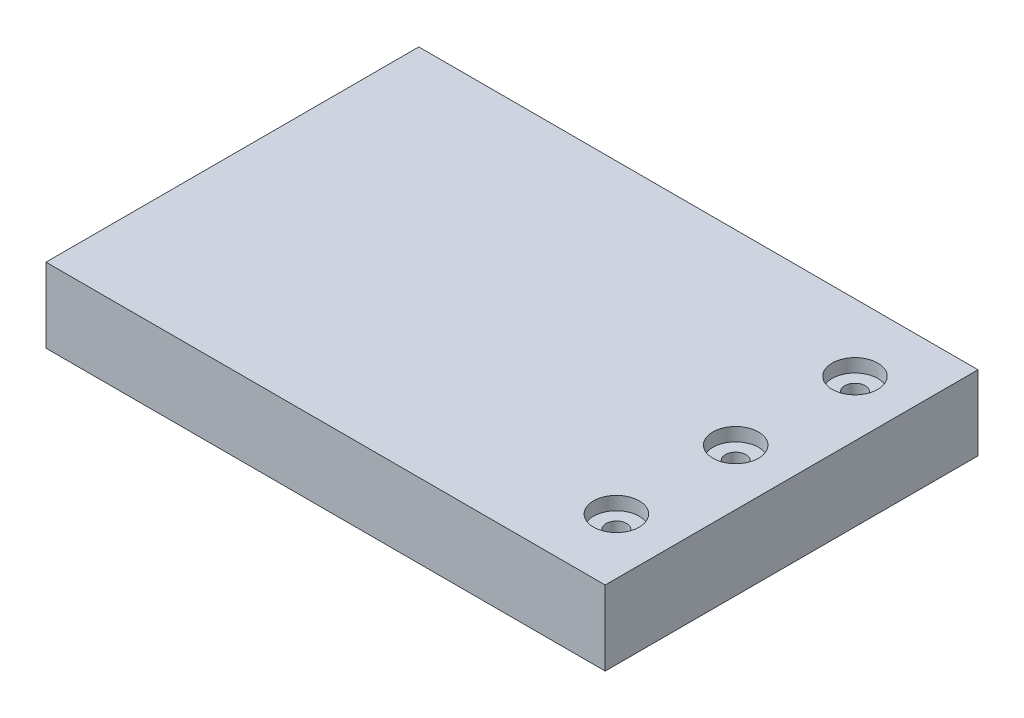
ISO-10303-21;
HEADER;
FILE_DESCRIPTION(('STEP AP214'),'2;1');
FILE_NAME('part.step','',(''),(''),'','','');
FILE_SCHEMA(('AUTOMOTIVE_DESIGN { 1 0 10303 214 1 1 1 1 }'));
ENDSEC;
DATA;
#1=APPLICATION_CONTEXT('core data for automotive mechanical design processes');
#2=APPLICATION_PROTOCOL_DEFINITION('international standard','automotive_design',2000,#1);
#3=PRODUCT_CONTEXT('',#1,'mechanical');
#4=PRODUCT('Part','Part','',(#3));
#5=PRODUCT_RELATED_PRODUCT_CATEGORY('part','',(#4));
#6=PRODUCT_DEFINITION_FORMATION('','',#4);
#7=PRODUCT_DEFINITION_CONTEXT('part definition',#1,'design');
#8=PRODUCT_DEFINITION('design','',#6,#7);
#9=PRODUCT_DEFINITION_SHAPE('','',#8);
#10=(LENGTH_UNIT() NAMED_UNIT(*) SI_UNIT(.MILLI.,.METRE.));
#11=(NAMED_UNIT(*) PLANE_ANGLE_UNIT() SI_UNIT($,.RADIAN.));
#12=(NAMED_UNIT(*) SI_UNIT($,.STERADIAN.) SOLID_ANGLE_UNIT());
#13=UNCERTAINTY_MEASURE_WITH_UNIT(LENGTH_MEASURE(1.E-05),#10,'distance_accuracy_value','');
#14=(GEOMETRIC_REPRESENTATION_CONTEXT(3) GLOBAL_UNCERTAINTY_ASSIGNED_CONTEXT((#13)) GLOBAL_UNIT_ASSIGNED_CONTEXT((#10,
#11,#12)) REPRESENTATION_CONTEXT('',''));
#15=CARTESIAN_POINT('',(0.,0.,0.));
#16=DIRECTION('',(0.,0.,1.));
#17=DIRECTION('',(1.,0.,0.));
#18=AXIS2_PLACEMENT_3D('',#15,#16,#17);
#19=CARTESIAN_POINT('',(75.,20.,-50.));
#20=DIRECTION('',(-1.,0.,0.));
#21=DIRECTION('',(0.,0.,1.));
#22=AXIS2_PLACEMENT_3D('',#19,#20,#21);
#23=PLANE('',#22);
#24=DIRECTION('',(0.,0.,-1.));
#25=VECTOR('',#24,1.);
#26=CARTESIAN_POINT('',(75.,0.,-50.));
#27=LINE('',#26,#25);
#28=CARTESIAN_POINT('',(75.,0.,50.));
#29=VERTEX_POINT('',#28);
#30=CARTESIAN_POINT('',(75.,0.,-50.));
#31=VERTEX_POINT('',#30);
#32=EDGE_CURVE('E200',#29,#31,#27,.T.);
#33=ORIENTED_EDGE('',*,*,#32,.T.);
#34=DIRECTION('',(0.,-1.,0.));
#35=VECTOR('',#34,1.);
#36=CARTESIAN_POINT('',(75.,20.,-50.));
#37=LINE('',#36,#35);
#38=CARTESIAN_POINT('',(75.,20.,-50.));
#39=VERTEX_POINT('',#38);
#40=EDGE_CURVE('E230',#39,#31,#37,.T.);
#41=ORIENTED_EDGE('',*,*,#40,.F.);
#42=DIRECTION('',(0.,0.,-1.));
#43=VECTOR('',#42,1.);
#44=CARTESIAN_POINT('',(75.,20.,-50.));
#45=LINE('',#44,#43);
#46=CARTESIAN_POINT('',(75.,20.,50.));
#47=VERTEX_POINT('',#46);
#48=EDGE_CURVE('E201',#47,#39,#45,.T.);
#49=ORIENTED_EDGE('',*,*,#48,.F.);
#50=DIRECTION('',(0.,-1.,0.));
#51=VECTOR('',#50,1.);
#52=CARTESIAN_POINT('',(75.,20.,50.));
#53=LINE('',#52,#51);
#54=EDGE_CURVE('E211',#47,#29,#53,.T.);
#55=ORIENTED_EDGE('',*,*,#54,.T.);
#56=EDGE_LOOP('',(#33,#41,#49,#55));
#57=FACE_BOUND('',#56,.T.);
#58=ADVANCED_FACE('F43',(#57),#23,.F.);
#59=CARTESIAN_POINT('',(-75.,20.,-50.));
#60=DIRECTION('',(0.,0.,1.));
#61=DIRECTION('',(1.,0.,0.));
#62=AXIS2_PLACEMENT_3D('',#59,#60,#61);
#63=PLANE('',#62);
#64=DIRECTION('',(-1.,0.,0.));
#65=VECTOR('',#64,1.);
#66=CARTESIAN_POINT('',(-75.,0.,-50.));
#67=LINE('',#66,#65);
#68=CARTESIAN_POINT('',(-75.,0.,-50.));
#69=VERTEX_POINT('',#68);
#70=EDGE_CURVE('E215',#31,#69,#67,.T.);
#71=ORIENTED_EDGE('',*,*,#70,.T.);
#72=DIRECTION('',(0.,-1.,0.));
#73=VECTOR('',#72,1.);
#74=CARTESIAN_POINT('',(-75.,20.,-50.));
#75=LINE('',#74,#73);
#76=CARTESIAN_POINT('',(-75.,20.,-50.));
#77=VERTEX_POINT('',#76);
#78=EDGE_CURVE('E227',#77,#69,#75,.T.);
#79=ORIENTED_EDGE('',*,*,#78,.F.);
#80=DIRECTION('',(-1.,0.,0.));
#81=VECTOR('',#80,1.);
#82=CARTESIAN_POINT('',(-75.,20.,-50.));
#83=LINE('',#82,#81);
#84=EDGE_CURVE('E139',#39,#77,#83,.T.);
#85=ORIENTED_EDGE('',*,*,#84,.F.);
#86=ORIENTED_EDGE('',*,*,#40,.T.);
#87=EDGE_LOOP('',(#71,#79,#85,#86));
#88=FACE_BOUND('',#87,.T.);
#89=ADVANCED_FACE('F347',(#88),#63,.F.);
#90=CARTESIAN_POINT('',(-75.,20.,-50.));
#91=DIRECTION('',(1.,0.,0.));
#92=DIRECTION('',(0.,0.,-1.));
#93=AXIS2_PLACEMENT_3D('',#90,#91,#92);
#94=PLANE('',#93);
#95=DIRECTION('',(0.,0.,1.));
#96=VECTOR('',#95,1.);
#97=CARTESIAN_POINT('',(-75.,0.,-50.));
#98=LINE('',#97,#96);
#99=CARTESIAN_POINT('',(-75.,0.,50.));
#100=VERTEX_POINT('',#99);
#101=EDGE_CURVE('E125',#69,#100,#98,.T.);
#102=ORIENTED_EDGE('',*,*,#101,.T.);
#103=DIRECTION('',(0.,-1.,0.));
#104=VECTOR('',#103,1.);
#105=CARTESIAN_POINT('',(-75.,20.,50.));
#106=LINE('',#105,#104);
#107=CARTESIAN_POINT('',(-75.,20.,50.));
#108=VERTEX_POINT('',#107);
#109=EDGE_CURVE('E224',#108,#100,#106,.T.);
#110=ORIENTED_EDGE('',*,*,#109,.F.);
#111=DIRECTION('',(0.,0.,1.));
#112=VECTOR('',#111,1.);
#113=CARTESIAN_POINT('',(-75.,20.,-50.));
#114=LINE('',#113,#112);
#115=EDGE_CURVE('E206',#77,#108,#114,.T.);
#116=ORIENTED_EDGE('',*,*,#115,.F.);
#117=ORIENTED_EDGE('',*,*,#78,.T.);
#118=EDGE_LOOP('',(#102,#110,#116,#117));
#119=FACE_BOUND('',#118,.T.);
#120=ADVANCED_FACE('F351',(#119),#94,.F.);
#121=CARTESIAN_POINT('',(-75.,20.,50.));
#122=DIRECTION('',(0.,0.,-1.));
#123=DIRECTION('',(-1.,0.,0.));
#124=AXIS2_PLACEMENT_3D('',#121,#122,#123);
#125=PLANE('',#124);
#126=DIRECTION('',(1.,0.,0.));
#127=VECTOR('',#126,1.);
#128=CARTESIAN_POINT('',(-75.,0.,50.));
#129=LINE('',#128,#127);
#130=EDGE_CURVE('E131',#100,#29,#129,.T.);
#131=ORIENTED_EDGE('',*,*,#130,.T.);
#132=ORIENTED_EDGE('',*,*,#54,.F.);
#133=DIRECTION('',(1.,0.,0.));
#134=VECTOR('',#133,1.);
#135=CARTESIAN_POINT('',(-75.,20.,50.));
#136=LINE('',#135,#134);
#137=EDGE_CURVE('E107',#108,#47,#136,.T.);
#138=ORIENTED_EDGE('',*,*,#137,.F.);
#139=ORIENTED_EDGE('',*,*,#109,.T.);
#140=EDGE_LOOP('',(#131,#132,#138,#139));
#141=FACE_BOUND('',#140,.T.);
#142=ADVANCED_FACE('F354',(#141),#125,.F.);
#143=CARTESIAN_POINT('',(0.,20.,0.));
#144=DIRECTION('',(0.,1.,0.));
#145=DIRECTION('',(0.,0.,1.));
#146=AXIS2_PLACEMENT_3D('',#143,#144,#145);
#147=PLANE('',#146);
#148=CARTESIAN_POINT('',(60.,20.,0.));
#149=DIRECTION('',(0.,1.,0.));
#150=DIRECTION('',(0.,0.,1.));
#151=AXIS2_PLACEMENT_3D('',#148,#149,#150);
#152=CIRCLE('',#151,6.12);
#153=CARTESIAN_POINT('',(60.,20.,6.12));
#154=VERTEX_POINT('',#153);
#155=EDGE_CURVE('E412',#154,#154,#152,.T.);
#156=ORIENTED_EDGE('',*,*,#155,.F.);
#157=EDGE_LOOP('',(#156));
#158=FACE_BOUND('',#157,.T.);
#159=CARTESIAN_POINT('',(60.,20.,-32.));
#160=DIRECTION('',(0.,1.,0.));
#161=DIRECTION('',(0.,0.,1.));
#162=AXIS2_PLACEMENT_3D('',#159,#160,#161);
#163=CIRCLE('',#162,6.12);
#164=CARTESIAN_POINT('',(60.,20.,-25.88));
#165=VERTEX_POINT('',#164);
#166=EDGE_CURVE('E160',#165,#165,#163,.T.);
#167=ORIENTED_EDGE('',*,*,#166,.F.);
#168=EDGE_LOOP('',(#167));
#169=FACE_BOUND('',#168,.T.);
#170=CARTESIAN_POINT('',(60.,20.,32.));
#171=DIRECTION('',(0.,1.,0.));
#172=DIRECTION('',(0.,0.,1.));
#173=AXIS2_PLACEMENT_3D('',#170,#171,#172);
#174=CIRCLE('',#173,6.12);
#175=CARTESIAN_POINT('',(60.,20.,38.12));
#176=VERTEX_POINT('',#175);
#177=EDGE_CURVE('E184',#176,#176,#174,.T.);
#178=ORIENTED_EDGE('',*,*,#177,.F.);
#179=EDGE_LOOP('',(#178));
#180=FACE_BOUND('',#179,.T.);
#181=ORIENTED_EDGE('',*,*,#48,.T.);
#182=ORIENTED_EDGE('',*,*,#84,.T.);
#183=ORIENTED_EDGE('',*,*,#115,.T.);
#184=ORIENTED_EDGE('',*,*,#137,.T.);
#185=EDGE_LOOP('',(#181,#182,#183,#184));
#186=FACE_BOUND('',#185,.T.);
#187=ADVANCED_FACE('F357',(#158,#169,#180,#186),#147,.T.);
#188=CARTESIAN_POINT('',(0.,0.,0.));
#189=DIRECTION('',(0.,1.,0.));
#190=DIRECTION('',(0.,0.,1.));
#191=AXIS2_PLACEMENT_3D('',#188,#189,#190);
#192=PLANE('',#191);
#193=ORIENTED_EDGE('',*,*,#32,.F.);
#194=ORIENTED_EDGE('',*,*,#130,.F.);
#195=ORIENTED_EDGE('',*,*,#101,.F.);
#196=ORIENTED_EDGE('',*,*,#70,.F.);
#197=EDGE_LOOP('',(#193,#194,#195,#196));
#198=FACE_BOUND('',#197,.T.);
#199=ADVANCED_FACE('F358',(#198),#192,.F.);
#200=CARTESIAN_POINT('',(60.,5.,32.));
#201=DIRECTION('',(0.,1.,0.));
#202=DIRECTION('',(0.,0.,1.));
#203=AXIS2_PLACEMENT_3D('',#200,#201,#202);
#204=CONICAL_SURFACE('',#203,2.74999999999999,1.02974425867665);
#205=CARTESIAN_POINT('',(60.,3.34763329767421,32.));
#206=VERTEX_POINT('',#205);
#207=VERTEX_LOOP('',#206);
#208=FACE_BOUND('',#207,.T.);
#209=CARTESIAN_POINT('',(60.,5.,32.));
#210=DIRECTION('',(0.,1.,0.));
#211=DIRECTION('',(0.,0.,1.));
#212=AXIS2_PLACEMENT_3D('',#209,#210,#211);
#213=CIRCLE('',#212,2.74999999999999);
#214=CARTESIAN_POINT('',(60.,5.,34.75));
#215=VERTEX_POINT('',#214);
#216=EDGE_CURVE('E196',#215,#215,#213,.T.);
#217=ORIENTED_EDGE('',*,*,#216,.T.);
#218=EDGE_LOOP('',(#217));
#219=FACE_BOUND('',#218,.T.);
#220=ADVANCED_FACE('F361',(#208,#219),#204,.F.);
#221=CARTESIAN_POINT('',(60.,20.,32.));
#222=DIRECTION('',(0.,1.,0.));
#223=DIRECTION('',(0.,0.,1.));
#224=AXIS2_PLACEMENT_3D('',#221,#222,#223);
#225=CYLINDRICAL_SURFACE('',#224,2.75);
#226=ORIENTED_EDGE('',*,*,#216,.F.);
#227=EDGE_LOOP('',(#226));
#228=FACE_BOUND('',#227,.T.);
#229=CARTESIAN_POINT('',(60.,16.42,32.));
#230=DIRECTION('',(0.,1.,0.));
#231=DIRECTION('',(0.,0.,1.));
#232=AXIS2_PLACEMENT_3D('',#229,#230,#231);
#233=CIRCLE('',#232,2.75);
#234=CARTESIAN_POINT('',(60.,16.42,34.75));
#235=VERTEX_POINT('',#234);
#236=EDGE_CURVE('E192',#235,#235,#233,.T.);
#237=ORIENTED_EDGE('',*,*,#236,.T.);
#238=EDGE_LOOP('',(#237));
#239=FACE_BOUND('',#238,.T.);
#240=ADVANCED_FACE('F368',(#228,#239),#225,.F.);
#241=CARTESIAN_POINT('',(62.75,16.42,32.));
#242=DIRECTION('',(0.,-1.,0.));
#243=DIRECTION('',(0.,0.,-1.));
#244=AXIS2_PLACEMENT_3D('',#241,#242,#243);
#245=PLANE('',#244);
#246=ORIENTED_EDGE('',*,*,#236,.F.);
#247=EDGE_LOOP('',(#246));
#248=FACE_BOUND('',#247,.T.);
#249=CARTESIAN_POINT('',(60.,16.42,32.));
#250=DIRECTION('',(0.,1.,0.));
#251=DIRECTION('',(0.,0.,1.));
#252=AXIS2_PLACEMENT_3D('',#249,#250,#251);
#253=CIRCLE('',#252,6.12);
#254=CARTESIAN_POINT('',(60.,16.42,38.12));
#255=VERTEX_POINT('',#254);
#256=EDGE_CURVE('E188',#255,#255,#253,.T.);
#257=ORIENTED_EDGE('',*,*,#256,.T.);
#258=EDGE_LOOP('',(#257));
#259=FACE_BOUND('',#258,.T.);
#260=ADVANCED_FACE('F372',(#248,#259),#245,.F.);
#261=CARTESIAN_POINT('',(60.,20.,32.));
#262=DIRECTION('',(0.,1.,0.));
#263=DIRECTION('',(0.,0.,1.));
#264=AXIS2_PLACEMENT_3D('',#261,#262,#263);
#265=CYLINDRICAL_SURFACE('',#264,6.12);
#266=ORIENTED_EDGE('',*,*,#256,.F.);
#267=EDGE_LOOP('',(#266));
#268=FACE_BOUND('',#267,.T.);
#269=ORIENTED_EDGE('',*,*,#177,.T.);
#270=EDGE_LOOP('',(#269));
#271=FACE_BOUND('',#270,.T.);
#272=ADVANCED_FACE('F376',(#268,#271),#265,.F.);
#273=CARTESIAN_POINT('',(60.,5.,-32.));
#274=DIRECTION('',(0.,1.,0.));
#275=DIRECTION('',(0.,0.,1.));
#276=AXIS2_PLACEMENT_3D('',#273,#274,#275);
#277=CONICAL_SURFACE('',#276,2.75,1.02974425867665);
#278=CARTESIAN_POINT('',(60.,3.34763329767421,-32.));
#279=VERTEX_POINT('',#278);
#280=VERTEX_LOOP('',#279);
#281=FACE_BOUND('',#280,.T.);
#282=CARTESIAN_POINT('',(60.,5.,-32.));
#283=DIRECTION('',(0.,1.,0.));
#284=DIRECTION('',(0.,0.,1.));
#285=AXIS2_PLACEMENT_3D('',#282,#283,#284);
#286=CIRCLE('',#285,2.75);
#287=CARTESIAN_POINT('',(60.,5.,-29.25));
#288=VERTEX_POINT('',#287);
#289=EDGE_CURVE('E180',#288,#288,#286,.T.);
#290=ORIENTED_EDGE('',*,*,#289,.T.);
#291=EDGE_LOOP('',(#290));
#292=FACE_BOUND('',#291,.T.);
#293=ADVANCED_FACE('F380',(#281,#292),#277,.F.);
#294=CARTESIAN_POINT('',(60.,20.,-32.));
#295=DIRECTION('',(0.,1.,0.));
#296=DIRECTION('',(0.,0.,1.));
#297=AXIS2_PLACEMENT_3D('',#294,#295,#296);
#298=CYLINDRICAL_SURFACE('',#297,2.75);
#299=ORIENTED_EDGE('',*,*,#289,.F.);
#300=EDGE_LOOP('',(#299));
#301=FACE_BOUND('',#300,.T.);
#302=CARTESIAN_POINT('',(60.,16.42,-32.));
#303=DIRECTION('',(0.,1.,0.));
#304=DIRECTION('',(0.,0.,1.));
#305=AXIS2_PLACEMENT_3D('',#302,#303,#304);
#306=CIRCLE('',#305,2.75);
#307=CARTESIAN_POINT('',(60.,16.42,-29.25));
#308=VERTEX_POINT('',#307);
#309=EDGE_CURVE('E176',#308,#308,#306,.T.);
#310=ORIENTED_EDGE('',*,*,#309,.T.);
#311=EDGE_LOOP('',(#310));
#312=FACE_BOUND('',#311,.T.);
#313=ADVANCED_FACE('F384',(#301,#312),#298,.F.);
#314=CARTESIAN_POINT('',(62.75,16.42,-32.));
#315=DIRECTION('',(0.,-1.,0.));
#316=DIRECTION('',(0.,0.,-1.));
#317=AXIS2_PLACEMENT_3D('',#314,#315,#316);
#318=PLANE('',#317);
#319=ORIENTED_EDGE('',*,*,#309,.F.);
#320=EDGE_LOOP('',(#319));
#321=FACE_BOUND('',#320,.T.);
#322=CARTESIAN_POINT('',(60.,16.42,-32.));
#323=DIRECTION('',(0.,1.,0.));
#324=DIRECTION('',(0.,0.,1.));
#325=AXIS2_PLACEMENT_3D('',#322,#323,#324);
#326=CIRCLE('',#325,6.12);
#327=CARTESIAN_POINT('',(60.,16.42,-25.88));
#328=VERTEX_POINT('',#327);
#329=EDGE_CURVE('E166',#328,#328,#326,.T.);
#330=ORIENTED_EDGE('',*,*,#329,.T.);
#331=EDGE_LOOP('',(#330));
#332=FACE_BOUND('',#331,.T.);
#333=ADVANCED_FACE('F388',(#321,#332),#318,.F.);
#334=CARTESIAN_POINT('',(60.,20.,-32.));
#335=DIRECTION('',(0.,1.,0.));
#336=DIRECTION('',(0.,0.,1.));
#337=AXIS2_PLACEMENT_3D('',#334,#335,#336);
#338=CYLINDRICAL_SURFACE('',#337,6.12);
#339=ORIENTED_EDGE('',*,*,#329,.F.);
#340=EDGE_LOOP('',(#339));
#341=FACE_BOUND('',#340,.T.);
#342=ORIENTED_EDGE('',*,*,#166,.T.);
#343=EDGE_LOOP('',(#342));
#344=FACE_BOUND('',#343,.T.);
#345=ADVANCED_FACE('F153',(#341,#344),#338,.F.);
#346=CARTESIAN_POINT('',(60.,5.,0.));
#347=DIRECTION('',(0.,1.,0.));
#348=DIRECTION('',(0.,0.,1.));
#349=AXIS2_PLACEMENT_3D('',#346,#347,#348);
#350=CONICAL_SURFACE('',#349,2.74999999999999,1.02974425867665);
#351=CARTESIAN_POINT('',(60.,3.34763329767421,0.));
#352=VERTEX_POINT('',#351);
#353=VERTEX_LOOP('',#352);
#354=FACE_BOUND('',#353,.T.);
#355=CARTESIAN_POINT('',(60.,5.,0.));
#356=DIRECTION('',(0.,1.,0.));
#357=DIRECTION('',(0.,0.,1.));
#358=AXIS2_PLACEMENT_3D('',#355,#356,#357);
#359=CIRCLE('',#358,2.74999999999999);
#360=CARTESIAN_POINT('',(60.,5.,2.74999999999999));
#361=VERTEX_POINT('',#360);
#362=EDGE_CURVE('E157',#361,#361,#359,.T.);
#363=ORIENTED_EDGE('',*,*,#362,.T.);
#364=EDGE_LOOP('',(#363));
#365=FACE_BOUND('',#364,.T.);
#366=ADVANCED_FACE('F149',(#354,#365),#350,.F.);
#367=CARTESIAN_POINT('',(60.,20.,0.));
#368=DIRECTION('',(0.,1.,0.));
#369=DIRECTION('',(0.,0.,1.));
#370=AXIS2_PLACEMENT_3D('',#367,#368,#369);
#371=CYLINDRICAL_SURFACE('',#370,2.75);
#372=ORIENTED_EDGE('',*,*,#362,.F.);
#373=EDGE_LOOP('',(#372));
#374=FACE_BOUND('',#373,.T.);
#375=CARTESIAN_POINT('',(60.,16.42,0.));
#376=DIRECTION('',(0.,1.,0.));
#377=DIRECTION('',(0.,0.,1.));
#378=AXIS2_PLACEMENT_3D('',#375,#376,#377);
#379=CIRCLE('',#378,2.75);
#380=CARTESIAN_POINT('',(60.,16.42,2.75));
#381=VERTEX_POINT('',#380);
#382=EDGE_CURVE('E161',#381,#381,#379,.T.);
#383=ORIENTED_EDGE('',*,*,#382,.T.);
#384=EDGE_LOOP('',(#383));
#385=FACE_BOUND('',#384,.T.);
#386=ADVANCED_FACE('F152',(#374,#385),#371,.F.);
#387=CARTESIAN_POINT('',(62.75,16.42,0.));
#388=DIRECTION('',(0.,-1.,0.));
#389=DIRECTION('',(0.,0.,-1.));
#390=AXIS2_PLACEMENT_3D('',#387,#388,#389);
#391=PLANE('',#390);
#392=ORIENTED_EDGE('',*,*,#382,.F.);
#393=EDGE_LOOP('',(#392));
#394=FACE_BOUND('',#393,.T.);
#395=CARTESIAN_POINT('',(60.,16.42,0.));
#396=DIRECTION('',(0.,1.,0.));
#397=DIRECTION('',(0.,0.,1.));
#398=AXIS2_PLACEMENT_3D('',#395,#396,#397);
#399=CIRCLE('',#398,6.12);
#400=CARTESIAN_POINT('',(60.,16.42,6.12));
#401=VERTEX_POINT('',#400);
#402=EDGE_CURVE('E169',#401,#401,#399,.T.);
#403=ORIENTED_EDGE('',*,*,#402,.T.);
#404=EDGE_LOOP('',(#403));
#405=FACE_BOUND('',#404,.T.);
#406=ADVANCED_FACE('F398',(#394,#405),#391,.F.);
#407=CARTESIAN_POINT('',(60.,20.,0.));
#408=DIRECTION('',(0.,1.,0.));
#409=DIRECTION('',(0.,0.,1.));
#410=AXIS2_PLACEMENT_3D('',#407,#408,#409);
#411=CYLINDRICAL_SURFACE('',#410,6.12);
#412=ORIENTED_EDGE('',*,*,#402,.F.);
#413=EDGE_LOOP('',(#412));
#414=FACE_BOUND('',#413,.T.);
#415=ORIENTED_EDGE('',*,*,#155,.T.);
#416=EDGE_LOOP('',(#415));
#417=FACE_BOUND('',#416,.T.);
#418=ADVANCED_FACE('F401',(#414,#417),#411,.F.);
#419=CLOSED_SHELL('',(#58,#89,#120,#142,#187,#199,#220,#240,#260,#272,#293,#313,#333,#345,#366,
#386,#406,#418));
#420=CARTESIAN_POINT('',(73.6,20.,-50.));
#421=DIRECTION('',(-1.,0.,0.));
#422=DIRECTION('',(0.,0.,1.));
#423=AXIS2_PLACEMENT_3D('',#420,#421,#422);
#424=PLANE('',#423);
#425=DIRECTION('',(0.,0.,-1.));
#426=VECTOR('',#425,1.);
#427=CARTESIAN_POINT('',(73.6,1.4,-50.));
#428=LINE('',#427,#426);
#429=CARTESIAN_POINT('',(73.6,1.4,48.6));
#430=VERTEX_POINT('',#429);
#431=CARTESIAN_POINT('',(73.6,1.4,-48.6));
#432=VERTEX_POINT('',#431);
#433=EDGE_CURVE('E47',#430,#432,#428,.T.);
#434=ORIENTED_EDGE('',*,*,#433,.F.);
#435=DIRECTION('',(0.,-1.,0.));
#436=VECTOR('',#435,1.);
#437=CARTESIAN_POINT('',(73.6,20.,48.6));
#438=LINE('',#437,#436);
#439=CARTESIAN_POINT('',(73.6,18.6,48.6));
#440=VERTEX_POINT('',#439);
#441=EDGE_CURVE('E305',#440,#430,#438,.T.);
#442=ORIENTED_EDGE('',*,*,#441,.F.);
#443=DIRECTION('',(0.,0.,-1.));
#444=VECTOR('',#443,1.);
#445=CARTESIAN_POINT('',(73.6,18.6,-50.));
#446=LINE('',#445,#444);
#447=CARTESIAN_POINT('',(73.6,18.6,-48.6));
#448=VERTEX_POINT('',#447);
#449=EDGE_CURVE('E284',#440,#448,#446,.T.);
#450=ORIENTED_EDGE('',*,*,#449,.T.);
#451=DIRECTION('',(0.,-1.,0.));
#452=VECTOR('',#451,1.);
#453=CARTESIAN_POINT('',(73.6,20.,-48.6));
#454=LINE('',#453,#452);
#455=EDGE_CURVE('E300',#448,#432,#454,.T.);
#456=ORIENTED_EDGE('',*,*,#455,.T.);
#457=EDGE_LOOP('',(#434,#442,#450,#456));
#458=FACE_BOUND('',#457,.T.);
#459=ADVANCED_FACE('F315',(#458),#424,.T.);
#460=CARTESIAN_POINT('',(-75.,20.,-48.6));
#461=DIRECTION('',(0.,0.,1.));
#462=DIRECTION('',(1.,0.,0.));
#463=AXIS2_PLACEMENT_3D('',#460,#461,#462);
#464=PLANE('',#463);
#465=DIRECTION('',(-1.,0.,0.));
#466=VECTOR('',#465,1.);
#467=CARTESIAN_POINT('',(-75.,1.4,-48.6));
#468=LINE('',#467,#466);
#469=CARTESIAN_POINT('',(-73.6,1.4,-48.6));
#470=VERTEX_POINT('',#469);
#471=EDGE_CURVE('E98',#432,#470,#468,.T.);
#472=ORIENTED_EDGE('',*,*,#471,.F.);
#473=ORIENTED_EDGE('',*,*,#455,.F.);
#474=DIRECTION('',(-1.,0.,0.));
#475=VECTOR('',#474,1.);
#476=CARTESIAN_POINT('',(-75.,18.6,-48.6));
#477=LINE('',#476,#475);
#478=CARTESIAN_POINT('',(-73.6,18.6,-48.6));
#479=VERTEX_POINT('',#478);
#480=EDGE_CURVE('E92',#448,#479,#477,.T.);
#481=ORIENTED_EDGE('',*,*,#480,.T.);
#482=DIRECTION('',(0.,-1.,0.));
#483=VECTOR('',#482,1.);
#484=CARTESIAN_POINT('',(-73.6,20.,-48.6));
#485=LINE('',#484,#483);
#486=EDGE_CURVE('E294',#479,#470,#485,.T.);
#487=ORIENTED_EDGE('',*,*,#486,.T.);
#488=EDGE_LOOP('',(#472,#473,#481,#487));
#489=FACE_BOUND('',#488,.T.);
#490=ADVANCED_FACE('F318',(#489),#464,.T.);
#491=CARTESIAN_POINT('',(-73.6,20.,-50.));
#492=DIRECTION('',(1.,0.,0.));
#493=DIRECTION('',(0.,0.,-1.));
#494=AXIS2_PLACEMENT_3D('',#491,#492,#493);
#495=PLANE('',#494);
#496=DIRECTION('',(0.,0.,1.));
#497=VECTOR('',#496,1.);
#498=CARTESIAN_POINT('',(-73.6,1.4,-50.));
#499=LINE('',#498,#497);
#500=CARTESIAN_POINT('',(-73.6,1.4,48.6));
#501=VERTEX_POINT('',#500);
#502=EDGE_CURVE('E297',#470,#501,#499,.T.);
#503=ORIENTED_EDGE('',*,*,#502,.F.);
#504=ORIENTED_EDGE('',*,*,#486,.F.);
#505=DIRECTION('',(0.,0.,1.));
#506=VECTOR('',#505,1.);
#507=CARTESIAN_POINT('',(-73.6,18.6,-50.));
#508=LINE('',#507,#506);
#509=CARTESIAN_POINT('',(-73.6,18.6,48.6));
#510=VERTEX_POINT('',#509);
#511=EDGE_CURVE('E279',#479,#510,#508,.T.);
#512=ORIENTED_EDGE('',*,*,#511,.T.);
#513=DIRECTION('',(0.,-1.,0.));
#514=VECTOR('',#513,1.);
#515=CARTESIAN_POINT('',(-73.6,20.,48.6));
#516=LINE('',#515,#514);
#517=EDGE_CURVE('E287',#510,#501,#516,.T.);
#518=ORIENTED_EDGE('',*,*,#517,.T.);
#519=EDGE_LOOP('',(#503,#504,#512,#518));
#520=FACE_BOUND('',#519,.T.);
#521=ADVANCED_FACE('F322',(#520),#495,.T.);
#522=CARTESIAN_POINT('',(-75.,20.,48.6));
#523=DIRECTION('',(0.,0.,-1.));
#524=DIRECTION('',(-1.,0.,0.));
#525=AXIS2_PLACEMENT_3D('',#522,#523,#524);
#526=PLANE('',#525);
#527=DIRECTION('',(1.,0.,0.));
#528=VECTOR('',#527,1.);
#529=CARTESIAN_POINT('',(-75.,1.4,48.6));
#530=LINE('',#529,#528);
#531=EDGE_CURVE('E291',#501,#430,#530,.T.);
#532=ORIENTED_EDGE('',*,*,#531,.F.);
#533=ORIENTED_EDGE('',*,*,#517,.F.);
#534=DIRECTION('',(1.,0.,0.));
#535=VECTOR('',#534,1.);
#536=CARTESIAN_POINT('',(-75.,18.6,48.6));
#537=LINE('',#536,#535);
#538=EDGE_CURVE('E276',#510,#440,#537,.T.);
#539=ORIENTED_EDGE('',*,*,#538,.T.);
#540=ORIENTED_EDGE('',*,*,#441,.T.);
#541=EDGE_LOOP('',(#532,#533,#539,#540));
#542=FACE_BOUND('',#541,.T.);
#543=ADVANCED_FACE('F325',(#542),#526,.T.);
#544=CARTESIAN_POINT('',(0.,18.6,0.));
#545=DIRECTION('',(0.,1.,0.));
#546=DIRECTION('',(0.,0.,1.));
#547=AXIS2_PLACEMENT_3D('',#544,#545,#546);
#548=PLANE('',#547);
#549=CARTESIAN_POINT('',(60.,18.6,0.));
#550=DIRECTION('',(0.,1.,0.));
#551=DIRECTION('',(0.,0.,1.));
#552=AXIS2_PLACEMENT_3D('',#549,#550,#551);
#553=CIRCLE('',#552,7.52);
#554=CARTESIAN_POINT('',(60.,18.6,7.52));
#555=VERTEX_POINT('',#554);
#556=EDGE_CURVE('E11',#555,#555,#553,.T.);
#557=ORIENTED_EDGE('',*,*,#556,.T.);
#558=EDGE_LOOP('',(#557));
#559=FACE_BOUND('',#558,.T.);
#560=CARTESIAN_POINT('',(60.,18.6,-32.));
#561=DIRECTION('',(0.,1.,0.));
#562=DIRECTION('',(0.,0.,1.));
#563=AXIS2_PLACEMENT_3D('',#560,#561,#562);
#564=CIRCLE('',#563,7.52);
#565=CARTESIAN_POINT('',(60.,18.6,-24.48));
#566=VERTEX_POINT('',#565);
#567=EDGE_CURVE('E244',#566,#566,#564,.T.);
#568=ORIENTED_EDGE('',*,*,#567,.T.);
#569=EDGE_LOOP('',(#568));
#570=FACE_BOUND('',#569,.T.);
#571=CARTESIAN_POINT('',(60.,18.6,32.));
#572=DIRECTION('',(0.,1.,0.));
#573=DIRECTION('',(0.,0.,1.));
#574=AXIS2_PLACEMENT_3D('',#571,#572,#573);
#575=CIRCLE('',#574,7.52);
#576=CARTESIAN_POINT('',(60.,18.6,39.52));
#577=VERTEX_POINT('',#576);
#578=EDGE_CURVE('E260',#577,#577,#575,.T.);
#579=ORIENTED_EDGE('',*,*,#578,.T.);
#580=EDGE_LOOP('',(#579));
#581=FACE_BOUND('',#580,.T.);
#582=ORIENTED_EDGE('',*,*,#449,.F.);
#583=ORIENTED_EDGE('',*,*,#538,.F.);
#584=ORIENTED_EDGE('',*,*,#511,.F.);
#585=ORIENTED_EDGE('',*,*,#480,.F.);
#586=EDGE_LOOP('',(#582,#583,#584,#585));
#587=FACE_BOUND('',#586,.T.);
#588=ADVANCED_FACE('F327',(#559,#570,#581,#587),#548,.F.);
#589=CARTESIAN_POINT('',(0.,1.4,0.));
#590=DIRECTION('',(0.,1.,0.));
#591=DIRECTION('',(0.,0.,1.));
#592=AXIS2_PLACEMENT_3D('',#589,#590,#591);
#593=PLANE('',#592);
#594=ORIENTED_EDGE('',*,*,#433,.T.);
#595=ORIENTED_EDGE('',*,*,#471,.T.);
#596=ORIENTED_EDGE('',*,*,#502,.T.);
#597=ORIENTED_EDGE('',*,*,#531,.T.);
#598=EDGE_LOOP('',(#594,#595,#596,#597));
#599=FACE_BOUND('',#598,.T.);
#600=ADVANCED_FACE('F313',(#599),#593,.T.);
#601=CARTESIAN_POINT('',(60.,3.79996577901705,32.));
#602=DIRECTION('',(0.,1.,0.));
#603=DIRECTION('',(0.,0.,1.));
#604=AXIS2_PLACEMENT_3D('',#601,#602,#603);
#605=CONICAL_SURFACE('',#604,3.47105330487407,1.02974425867665);
#606=CARTESIAN_POINT('',(60.,1.71434654157274,32.));
#607=VERTEX_POINT('',#606);
#608=VERTEX_LOOP('',#607);
#609=FACE_BOUND('',#608,.T.);
#610=CARTESIAN_POINT('',(60.,4.20791811053713,32.));
#611=DIRECTION('',(0.,1.,0.));
#612=DIRECTION('',(0.,0.,1.));
#613=AXIS2_PLACEMENT_3D('',#610,#611,#612);
#614=CIRCLE('',#613,4.15);
#615=CARTESIAN_POINT('',(60.,4.20791811053713,36.15));
#616=VERTEX_POINT('',#615);
#617=EDGE_CURVE('E272',#616,#616,#614,.T.);
#618=ORIENTED_EDGE('',*,*,#617,.F.);
#619=EDGE_LOOP('',(#618));
#620=FACE_BOUND('',#619,.T.);
#621=ADVANCED_FACE('F459',(#609,#620),#605,.T.);
#622=CARTESIAN_POINT('',(60.,20.,32.));
#623=DIRECTION('',(0.,1.,0.));
#624=DIRECTION('',(0.,0.,1.));
#625=AXIS2_PLACEMENT_3D('',#622,#623,#624);
#626=CYLINDRICAL_SURFACE('',#625,4.15);
#627=ORIENTED_EDGE('',*,*,#617,.T.);
#628=EDGE_LOOP('',(#627));
#629=FACE_BOUND('',#628,.T.);
#630=CARTESIAN_POINT('',(60.,15.02,32.));
#631=DIRECTION('',(0.,-1.,0.));
#632=DIRECTION('',(0.,0.,-1.));
#633=AXIS2_PLACEMENT_3D('',#630,#631,#632);
#634=CIRCLE('',#633,4.15);
#635=CARTESIAN_POINT('',(60.,15.02,27.85));
#636=VERTEX_POINT('',#635);
#637=EDGE_CURVE('E268',#636,#636,#634,.F.);
#638=ORIENTED_EDGE('',*,*,#637,.F.);
#639=EDGE_LOOP('',(#638));
#640=FACE_BOUND('',#639,.T.);
#641=ADVANCED_FACE('F467',(#629,#640),#626,.T.);
#642=CARTESIAN_POINT('',(62.75,15.02,32.));
#643=DIRECTION('',(0.,-1.,0.));
#644=DIRECTION('',(0.,0.,-1.));
#645=AXIS2_PLACEMENT_3D('',#642,#643,#644);
#646=PLANE('',#645);
#647=ORIENTED_EDGE('',*,*,#637,.T.);
#648=EDGE_LOOP('',(#647));
#649=FACE_BOUND('',#648,.T.);
#650=CARTESIAN_POINT('',(60.,15.02,32.));
#651=DIRECTION('',(0.,-1.,0.));
#652=DIRECTION('',(0.,0.,-1.));
#653=AXIS2_PLACEMENT_3D('',#650,#651,#652);
#654=CIRCLE('',#653,7.52);
#655=CARTESIAN_POINT('',(60.,15.02,24.48));
#656=VERTEX_POINT('',#655);
#657=EDGE_CURVE('E264',#656,#656,#654,.F.);
#658=ORIENTED_EDGE('',*,*,#657,.F.);
#659=EDGE_LOOP('',(#658));
#660=FACE_BOUND('',#659,.T.);
#661=ADVANCED_FACE('F476',(#649,#660),#646,.T.);
#662=CARTESIAN_POINT('',(60.,20.,32.));
#663=DIRECTION('',(0.,1.,0.));
#664=DIRECTION('',(0.,0.,1.));
#665=AXIS2_PLACEMENT_3D('',#662,#663,#664);
#666=CYLINDRICAL_SURFACE('',#665,7.52);
#667=ORIENTED_EDGE('',*,*,#657,.T.);
#668=EDGE_LOOP('',(#667));
#669=FACE_BOUND('',#668,.T.);
#670=ORIENTED_EDGE('',*,*,#578,.F.);
#671=EDGE_LOOP('',(#670));
#672=FACE_BOUND('',#671,.T.);
#673=ADVANCED_FACE('F485',(#669,#672),#666,.T.);
#674=CARTESIAN_POINT('',(60.,3.79996577901704,-32.));
#675=DIRECTION('',(0.,1.,0.));
#676=DIRECTION('',(0.,0.,1.));
#677=AXIS2_PLACEMENT_3D('',#674,#675,#676);
#678=CONICAL_SURFACE('',#677,3.47105330487408,1.02974425867665);
#679=CARTESIAN_POINT('',(60.,1.71434654157274,-32.));
#680=VERTEX_POINT('',#679);
#681=VERTEX_LOOP('',#680);
#682=FACE_BOUND('',#681,.T.);
#683=CARTESIAN_POINT('',(60.,4.20791811053712,-32.));
#684=DIRECTION('',(0.,1.,0.));
#685=DIRECTION('',(0.,0.,1.));
#686=AXIS2_PLACEMENT_3D('',#683,#684,#685);
#687=CIRCLE('',#686,4.15);
#688=CARTESIAN_POINT('',(60.,4.20791811053712,-27.85));
#689=VERTEX_POINT('',#688);
#690=EDGE_CURVE('E256',#689,#689,#687,.T.);
#691=ORIENTED_EDGE('',*,*,#690,.F.);
#692=EDGE_LOOP('',(#691));
#693=FACE_BOUND('',#692,.T.);
#694=ADVANCED_FACE('F494',(#682,#693),#678,.T.);
#695=CARTESIAN_POINT('',(60.,20.,-32.));
#696=DIRECTION('',(0.,1.,0.));
#697=DIRECTION('',(0.,0.,1.));
#698=AXIS2_PLACEMENT_3D('',#695,#696,#697);
#699=CYLINDRICAL_SURFACE('',#698,4.15);
#700=ORIENTED_EDGE('',*,*,#690,.T.);
#701=EDGE_LOOP('',(#700));
#702=FACE_BOUND('',#701,.T.);
#703=CARTESIAN_POINT('',(60.,15.02,-32.));
#704=DIRECTION('',(0.,-1.,0.));
#705=DIRECTION('',(0.,0.,-1.));
#706=AXIS2_PLACEMENT_3D('',#703,#704,#705);
#707=CIRCLE('',#706,4.15);
#708=CARTESIAN_POINT('',(60.,15.02,-36.15));
#709=VERTEX_POINT('',#708);
#710=EDGE_CURVE('E252',#709,#709,#707,.F.);
#711=ORIENTED_EDGE('',*,*,#710,.F.);
#712=EDGE_LOOP('',(#711));
#713=FACE_BOUND('',#712,.T.);
#714=ADVANCED_FACE('F503',(#702,#713),#699,.T.);
#715=CARTESIAN_POINT('',(62.75,15.02,-32.));
#716=DIRECTION('',(0.,-1.,0.));
#717=DIRECTION('',(0.,0.,-1.));
#718=AXIS2_PLACEMENT_3D('',#715,#716,#717);
#719=PLANE('',#718);
#720=ORIENTED_EDGE('',*,*,#710,.T.);
#721=EDGE_LOOP('',(#720));
#722=FACE_BOUND('',#721,.T.);
#723=CARTESIAN_POINT('',(60.,15.02,-32.));
#724=DIRECTION('',(0.,-1.,0.));
#725=DIRECTION('',(0.,0.,-1.));
#726=AXIS2_PLACEMENT_3D('',#723,#724,#725);
#727=CIRCLE('',#726,7.52);
#728=CARTESIAN_POINT('',(60.,15.02,-39.52));
#729=VERTEX_POINT('',#728);
#730=EDGE_CURVE('E248',#729,#729,#727,.F.);
#731=ORIENTED_EDGE('',*,*,#730,.F.);
#732=EDGE_LOOP('',(#731));
#733=FACE_BOUND('',#732,.T.);
#734=ADVANCED_FACE('F512',(#722,#733),#719,.T.);
#735=CARTESIAN_POINT('',(60.,20.,-32.));
#736=DIRECTION('',(0.,1.,0.));
#737=DIRECTION('',(0.,0.,1.));
#738=AXIS2_PLACEMENT_3D('',#735,#736,#737);
#739=CYLINDRICAL_SURFACE('',#738,7.52);
#740=ORIENTED_EDGE('',*,*,#730,.T.);
#741=EDGE_LOOP('',(#740));
#742=FACE_BOUND('',#741,.T.);
#743=ORIENTED_EDGE('',*,*,#567,.F.);
#744=EDGE_LOOP('',(#743));
#745=FACE_BOUND('',#744,.T.);
#746=ADVANCED_FACE('F521',(#742,#745),#739,.T.);
#747=CARTESIAN_POINT('',(60.,3.79996577901705,0.));
#748=DIRECTION('',(0.,1.,0.));
#749=DIRECTION('',(0.,0.,1.));
#750=AXIS2_PLACEMENT_3D('',#747,#748,#749);
#751=CONICAL_SURFACE('',#750,3.47105330487407,1.02974425867665);
#752=CARTESIAN_POINT('',(60.,1.71434654157274,0.));
#753=VERTEX_POINT('',#752);
#754=VERTEX_LOOP('',#753);
#755=FACE_BOUND('',#754,.T.);
#756=CARTESIAN_POINT('',(60.,4.20791811053713,0.));
#757=DIRECTION('',(0.,1.,0.));
#758=DIRECTION('',(0.,0.,1.));
#759=AXIS2_PLACEMENT_3D('',#756,#757,#758);
#760=CIRCLE('',#759,4.15);
#761=CARTESIAN_POINT('',(60.,4.20791811053713,4.15));
#762=VERTEX_POINT('',#761);
#763=EDGE_CURVE('E240',#762,#762,#760,.T.);
#764=ORIENTED_EDGE('',*,*,#763,.F.);
#765=EDGE_LOOP('',(#764));
#766=FACE_BOUND('',#765,.T.);
#767=ADVANCED_FACE('F530',(#755,#766),#751,.T.);
#768=CARTESIAN_POINT('',(60.,20.,0.));
#769=DIRECTION('',(0.,1.,0.));
#770=DIRECTION('',(0.,0.,1.));
#771=AXIS2_PLACEMENT_3D('',#768,#769,#770);
#772=CYLINDRICAL_SURFACE('',#771,4.15);
#773=ORIENTED_EDGE('',*,*,#763,.T.);
#774=EDGE_LOOP('',(#773));
#775=FACE_BOUND('',#774,.T.);
#776=CARTESIAN_POINT('',(60.,15.02,0.));
#777=DIRECTION('',(0.,-1.,0.));
#778=DIRECTION('',(0.,0.,-1.));
#779=AXIS2_PLACEMENT_3D('',#776,#777,#778);
#780=CIRCLE('',#779,4.15);
#781=CARTESIAN_POINT('',(60.,15.02,-4.15));
#782=VERTEX_POINT('',#781);
#783=EDGE_CURVE('E236',#782,#782,#780,.F.);
#784=ORIENTED_EDGE('',*,*,#783,.F.);
#785=EDGE_LOOP('',(#784));
#786=FACE_BOUND('',#785,.T.);
#787=ADVANCED_FACE('F539',(#775,#786),#772,.T.);
#788=CARTESIAN_POINT('',(62.75,15.02,0.));
#789=DIRECTION('',(0.,-1.,0.));
#790=DIRECTION('',(0.,0.,-1.));
#791=AXIS2_PLACEMENT_3D('',#788,#789,#790);
#792=PLANE('',#791);
#793=ORIENTED_EDGE('',*,*,#783,.T.);
#794=EDGE_LOOP('',(#793));
#795=FACE_BOUND('',#794,.T.);
#796=CARTESIAN_POINT('',(60.,15.02,0.));
#797=DIRECTION('',(0.,-1.,0.));
#798=DIRECTION('',(0.,0.,-1.));
#799=AXIS2_PLACEMENT_3D('',#796,#797,#798);
#800=CIRCLE('',#799,7.52);
#801=CARTESIAN_POINT('',(60.,15.02,-7.52));
#802=VERTEX_POINT('',#801);
#803=EDGE_CURVE('E55',#802,#802,#800,.F.);
#804=ORIENTED_EDGE('',*,*,#803,.F.);
#805=EDGE_LOOP('',(#804));
#806=FACE_BOUND('',#805,.T.);
#807=ADVANCED_FACE('F547',(#795,#806),#792,.T.);
#808=CARTESIAN_POINT('',(60.,20.,0.));
#809=DIRECTION('',(0.,1.,0.));
#810=DIRECTION('',(0.,0.,1.));
#811=AXIS2_PLACEMENT_3D('',#808,#809,#810);
#812=CYLINDRICAL_SURFACE('',#811,7.52);
#813=ORIENTED_EDGE('',*,*,#803,.T.);
#814=EDGE_LOOP('',(#813));
#815=FACE_BOUND('',#814,.T.);
#816=ORIENTED_EDGE('',*,*,#556,.F.);
#817=EDGE_LOOP('',(#816));
#818=FACE_BOUND('',#817,.T.);
#819=ADVANCED_FACE('F45',(#815,#818),#812,.T.);
#820=CLOSED_SHELL('',(#459,#490,#521,#543,#588,#600,#621,#641,#661,#673,#694,#714,#734,#746,
#767,#787,#807,#819));
#821=ORIENTED_CLOSED_SHELL('',*,#820,.T.);
#822=BREP_WITH_VOIDS('B2',#419,(#821));
#823=ADVANCED_BREP_SHAPE_REPRESENTATION('',(#18,#822),#14);
#824=SHAPE_DEFINITION_REPRESENTATION(#9,#823);
ENDSEC;
END-ISO-10303-21;
